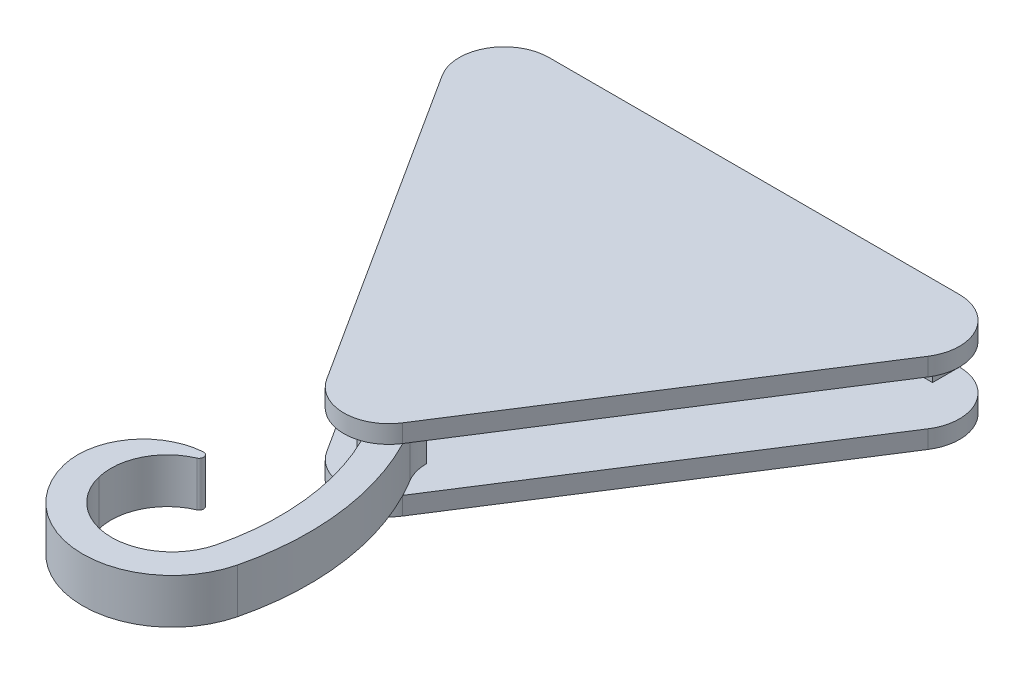
ISO-10303-21;
HEADER;
FILE_DESCRIPTION(('STEP AP214'),'2;1');
FILE_NAME('part.step','',(''),(''),'','','');
FILE_SCHEMA(('AUTOMOTIVE_DESIGN { 1 0 10303 214 1 1 1 1 }'));
ENDSEC;
DATA;
#1=APPLICATION_CONTEXT('core data for automotive mechanical design processes');
#2=APPLICATION_PROTOCOL_DEFINITION('international standard','automotive_design',2000,#1);
#3=PRODUCT_CONTEXT('',#1,'mechanical');
#4=PRODUCT('Part','Part','',(#3));
#5=PRODUCT_RELATED_PRODUCT_CATEGORY('part','',(#4));
#6=PRODUCT_DEFINITION_FORMATION('','',#4);
#7=PRODUCT_DEFINITION_CONTEXT('part definition',#1,'design');
#8=PRODUCT_DEFINITION('design','',#6,#7);
#9=PRODUCT_DEFINITION_SHAPE('','',#8);
#10=(LENGTH_UNIT() NAMED_UNIT(*) SI_UNIT(.MILLI.,.METRE.));
#11=(NAMED_UNIT(*) PLANE_ANGLE_UNIT() SI_UNIT($,.RADIAN.));
#12=(NAMED_UNIT(*) SI_UNIT($,.STERADIAN.) SOLID_ANGLE_UNIT());
#13=UNCERTAINTY_MEASURE_WITH_UNIT(LENGTH_MEASURE(1.E-05),#10,'distance_accuracy_value','');
#14=(GEOMETRIC_REPRESENTATION_CONTEXT(3) GLOBAL_UNCERTAINTY_ASSIGNED_CONTEXT((#13)) GLOBAL_UNIT_ASSIGNED_CONTEXT((#10,
#11,#12)) REPRESENTATION_CONTEXT('',''));
#15=CARTESIAN_POINT('',(0.,0.,0.));
#16=DIRECTION('',(0.,0.,1.));
#17=DIRECTION('',(1.,0.,0.));
#18=AXIS2_PLACEMENT_3D('',#15,#16,#17);
#19=CARTESIAN_POINT('',(0.,20.,407.244862002151));
#20=DIRECTION('',(0.,-1.,0.));
#21=DIRECTION('',(0.,0.,-1.));
#22=AXIS2_PLACEMENT_3D('',#19,#20,#21);
#23=PLANE('',#22);
#24=DIRECTION('',(0.,0.,-1.));
#25=VECTOR('',#24,1.);
#26=CARTESIAN_POINT('',(228.636711681377,20.,0.));
#27=LINE('',#26,#25);
#28=CARTESIAN_POINT('',(228.636711681377,20.,30.));
#29=VERTEX_POINT('',#28);
#30=CARTESIAN_POINT('',(228.636711681377,20.,0.));
#31=VERTEX_POINT('',#30);
#32=EDGE_CURVE('E58',#29,#31,#27,.T.);
#33=ORIENTED_EDGE('',*,*,#32,.F.);
#34=DIRECTION('',(1.,0.,0.));
#35=VECTOR('',#34,1.);
#36=CARTESIAN_POINT('',(228.636711681377,20.,30.));
#37=LINE('',#36,#35);
#38=CARTESIAN_POINT('',(-228.636711681377,20.,30.0000000000001));
#39=VERTEX_POINT('',#38);
#40=EDGE_CURVE('E63',#39,#29,#37,.T.);
#41=ORIENTED_EDGE('',*,*,#40,.F.);
#42=DIRECTION('',(0.,0.,1.));
#43=VECTOR('',#42,1.);
#44=CARTESIAN_POINT('',(-228.636711681377,20.,0.));
#45=LINE('',#44,#43);
#46=CARTESIAN_POINT('',(-228.636711681377,20.,0.));
#47=VERTEX_POINT('',#46);
#48=EDGE_CURVE('E253',#47,#39,#45,.T.);
#49=ORIENTED_EDGE('',*,*,#48,.F.);
#50=CARTESIAN_POINT('',(-228.636711681377,20.,50.));
#51=DIRECTION('',(0.,1.,0.));
#52=DIRECTION('',(0.,0.,-1.));
#53=AXIS2_PLACEMENT_3D('',#50,#51,#52);
#54=CIRCLE('',#53,50.);
#55=CARTESIAN_POINT('',(-270.750281714452,20.,76.9526848211684));
#56=VERTEX_POINT('',#55);
#57=EDGE_CURVE('E228',#47,#56,#54,.T.);
#58=ORIENTED_EDGE('',*,*,#57,.T.);
#59=DIRECTION('',(0.539053696423367,0.,0.842271400661511));
#60=VECTOR('',#59,1.);
#61=CARTESIAN_POINT('',(-270.750281714452,20.,76.9526848211684));
#62=LINE('',#61,#60);
#63=CARTESIAN_POINT('',(-42.1135700330756,20.,434.197546823319));
#64=VERTEX_POINT('',#63);
#65=EDGE_CURVE('E237',#56,#64,#62,.T.);
#66=ORIENTED_EDGE('',*,*,#65,.T.);
#67=CARTESIAN_POINT('',(0.,20.,407.244862002151));
#68=DIRECTION('',(0.,1.,0.));
#69=DIRECTION('',(0.,0.,-1.));
#70=AXIS2_PLACEMENT_3D('',#67,#68,#69);
#71=CIRCLE('',#70,50.);
#72=CARTESIAN_POINT('',(16.6552850478013,20.,454.389336545585));
#73=VERTEX_POINT('',#72);
#74=EDGE_CURVE('E478',#64,#73,#71,.T.);
#75=ORIENTED_EDGE('',*,*,#74,.T.);
#76=CARTESIAN_POINT('',(-224.009305688203,20.,571.900295172143));
#77=DIRECTION('',(0.,-1.,0.));
#78=DIRECTION('',(0.,0.,-1.));
#79=AXIS2_PLACEMENT_3D('',#76,#77,#78);
#80=CIRCLE('',#79,267.821340881306);
#81=CARTESIAN_POINT('',(10.5082209750438,20.,442.556565833553));
#82=VERTEX_POINT('',#81);
#83=EDGE_CURVE('E400',#82,#73,#80,.T.);
#84=ORIENTED_EDGE('',*,*,#83,.F.);
#85=CARTESIAN_POINT('',(54.2906779464581,20.,418.409175466347));
#86=DIRECTION('',(0.,1.,0.));
#87=DIRECTION('',(0.,0.,1.));
#88=AXIS2_PLACEMENT_3D('',#85,#86,#87);
#89=CIRCLE('',#88,50.);
#90=CARTESIAN_POINT('',(4.29067794645814,20.,418.409175466347));
#91=VERTEX_POINT('',#90);
#92=EDGE_CURVE('E395',#91,#82,#89,.T.);
#93=ORIENTED_EDGE('',*,*,#92,.F.);
#94=DIRECTION('',(0.,0.,-1.));
#95=VECTOR('',#94,1.);
#96=CARTESIAN_POINT('',(4.29067794645795,20.,431.873911572928));
#97=LINE('',#96,#95);
#98=CARTESIAN_POINT('',(4.29067794645795,20.,431.873911572928));
#99=VERTEX_POINT('',#98);
#100=EDGE_CURVE('E391',#99,#91,#97,.T.);
#101=ORIENTED_EDGE('',*,*,#100,.F.);
#102=CARTESIAN_POINT('',(0.,20.,407.244862002151));
#103=DIRECTION('',(0.,1.,0.));
#104=DIRECTION('',(0.,0.,1.));
#105=AXIS2_PLACEMENT_3D('',#102,#103,#104);
#106=CIRCLE('',#105,24.9999999999999);
#107=CARTESIAN_POINT('',(25.,20.,407.244862002151));
#108=VERTEX_POINT('',#107);
#109=EDGE_CURVE('E341',#108,#99,#106,.T.);
#110=ORIENTED_EDGE('',*,*,#109,.F.);
#111=DIRECTION('',(0.,0.,1.));
#112=VECTOR('',#111,1.);
#113=CARTESIAN_POINT('',(25.,20.,407.244862002151));
#114=LINE('',#113,#112);
#115=CARTESIAN_POINT('',(25.,20.,389.984284024528));
#116=VERTEX_POINT('',#115);
#117=EDGE_CURVE('E347',#116,#108,#114,.T.);
#118=ORIENTED_EDGE('',*,*,#117,.F.);
#119=CARTESIAN_POINT('',(75.,20.,389.984284024528));
#120=DIRECTION('',(0.,-1.,0.));
#121=DIRECTION('',(0.,0.,-1.));
#122=AXIS2_PLACEMENT_3D('',#119,#120,#121);
#123=CIRCLE('',#122,50.);
#124=CARTESIAN_POINT('',(32.2843849016854,20.,415.972285617045));
#125=VERTEX_POINT('',#124);
#126=EDGE_CURVE('E423',#125,#116,#123,.T.);
#127=ORIENTED_EDGE('',*,*,#126,.F.);
#128=CARTESIAN_POINT('',(-224.009305688203,20.,571.900295172143));
#129=DIRECTION('',(0.,1.,0.));
#130=DIRECTION('',(0.,0.,-1.));
#131=AXIS2_PLACEMENT_3D('',#128,#129,#130);
#132=CIRCLE('',#131,300.);
#133=CARTESIAN_POINT('',(42.338379552463,20.,433.846281949277));
#134=VERTEX_POINT('',#133);
#135=EDGE_CURVE('E49',#134,#125,#132,.T.);
#136=ORIENTED_EDGE('',*,*,#135,.F.);
#137=DIRECTION('',(0.539053696423367,0.,-0.842271400661511));
#138=VECTOR('',#137,1.);
#139=CARTESIAN_POINT('',(270.750281714452,20.,76.9526848211684));
#140=LINE('',#139,#138);
#141=CARTESIAN_POINT('',(270.750281714452,20.,76.9526848211684));
#142=VERTEX_POINT('',#141);
#143=EDGE_CURVE('E482',#134,#142,#140,.T.);
#144=ORIENTED_EDGE('',*,*,#143,.T.);
#145=CARTESIAN_POINT('',(228.636711681377,20.,50.));
#146=DIRECTION('',(0.,1.,0.));
#147=DIRECTION('',(0.,0.,1.));
#148=AXIS2_PLACEMENT_3D('',#145,#146,#147);
#149=CIRCLE('',#148,50.);
#150=EDGE_CURVE('E238',#142,#31,#149,.T.);
#151=ORIENTED_EDGE('',*,*,#150,.T.);
#152=EDGE_LOOP('',(#33,#41,#49,#58,#66,#75,#84,#93,#101,#110,#118,#127,#136,#144,#151));
#153=FACE_BOUND('',#152,.T.);
#154=ADVANCED_FACE('F39',(#153),#23,.F.);
#155=CARTESIAN_POINT('',(0.,70.,407.244862002151));
#156=DIRECTION('',(0.,-1.,0.));
#157=DIRECTION('',(0.,0.,-1.));
#158=AXIS2_PLACEMENT_3D('',#155,#156,#157);
#159=PLANE('',#158);
#160=DIRECTION('',(-1.,0.,0.));
#161=VECTOR('',#160,1.);
#162=CARTESIAN_POINT('',(228.636711681377,70.,30.));
#163=LINE('',#162,#161);
#164=CARTESIAN_POINT('',(228.636711681377,70.,30.));
#165=VERTEX_POINT('',#164);
#166=CARTESIAN_POINT('',(-228.636711681377,70.,30.));
#167=VERTEX_POINT('',#166);
#168=EDGE_CURVE('E270',#165,#167,#163,.T.);
#169=ORIENTED_EDGE('',*,*,#168,.F.);
#170=DIRECTION('',(0.,0.,1.));
#171=VECTOR('',#170,1.);
#172=CARTESIAN_POINT('',(228.636711681377,70.,0.));
#173=LINE('',#172,#171);
#174=CARTESIAN_POINT('',(228.636711681377,70.,0.));
#175=VERTEX_POINT('',#174);
#176=EDGE_CURVE('E279',#175,#165,#173,.T.);
#177=ORIENTED_EDGE('',*,*,#176,.F.);
#178=CARTESIAN_POINT('',(228.636711681377,70.,50.));
#179=DIRECTION('',(0.,1.,0.));
#180=DIRECTION('',(0.,0.,1.));
#181=AXIS2_PLACEMENT_3D('',#178,#179,#180);
#182=CIRCLE('',#181,50.);
#183=CARTESIAN_POINT('',(270.750281714452,70.,76.9526848211684));
#184=VERTEX_POINT('',#183);
#185=EDGE_CURVE('E310',#184,#175,#182,.T.);
#186=ORIENTED_EDGE('',*,*,#185,.F.);
#187=DIRECTION('',(0.539053696423367,0.,-0.842271400661511));
#188=VECTOR('',#187,1.);
#189=CARTESIAN_POINT('',(270.750281714452,70.,76.9526848211684));
#190=LINE('',#189,#188);
#191=CARTESIAN_POINT('',(42.3383795524631,70.,433.846281949277));
#192=VERTEX_POINT('',#191);
#193=EDGE_CURVE('E305',#192,#184,#190,.T.);
#194=ORIENTED_EDGE('',*,*,#193,.F.);
#195=CARTESIAN_POINT('',(-224.009305688203,70.,571.900295172143));
#196=DIRECTION('',(0.,1.,0.));
#197=DIRECTION('',(0.,0.,-1.));
#198=AXIS2_PLACEMENT_3D('',#195,#196,#197);
#199=CIRCLE('',#198,300.);
#200=CARTESIAN_POINT('',(32.2843849016854,70.,415.972285617045));
#201=VERTEX_POINT('',#200);
#202=EDGE_CURVE('E375',#192,#201,#199,.T.);
#203=ORIENTED_EDGE('',*,*,#202,.T.);
#204=CARTESIAN_POINT('',(75.,70.,389.984284024528));
#205=DIRECTION('',(0.,-1.,0.));
#206=DIRECTION('',(0.,0.,-1.));
#207=AXIS2_PLACEMENT_3D('',#204,#205,#206);
#208=CIRCLE('',#207,50.);
#209=CARTESIAN_POINT('',(25.,70.,389.984284024528));
#210=VERTEX_POINT('',#209);
#211=EDGE_CURVE('E379',#201,#210,#208,.T.);
#212=ORIENTED_EDGE('',*,*,#211,.T.);
#213=DIRECTION('',(0.,0.,1.));
#214=VECTOR('',#213,1.);
#215=CARTESIAN_POINT('',(25.,70.,407.244862002151));
#216=LINE('',#215,#214);
#217=CARTESIAN_POINT('',(25.,70.,407.244862002151));
#218=VERTEX_POINT('',#217);
#219=EDGE_CURVE('E383',#210,#218,#216,.T.);
#220=ORIENTED_EDGE('',*,*,#219,.T.);
#221=CARTESIAN_POINT('',(0.,70.,407.244862002151));
#222=DIRECTION('',(0.,1.,0.));
#223=DIRECTION('',(0.,0.,1.));
#224=AXIS2_PLACEMENT_3D('',#221,#222,#223);
#225=CIRCLE('',#224,24.9999999999999);
#226=CARTESIAN_POINT('',(4.29067794645795,70.,431.873911572928));
#227=VERTEX_POINT('',#226);
#228=EDGE_CURVE('E342',#218,#227,#225,.T.);
#229=ORIENTED_EDGE('',*,*,#228,.T.);
#230=DIRECTION('',(0.,0.,-1.));
#231=VECTOR('',#230,1.);
#232=CARTESIAN_POINT('',(4.29067794645795,70.,431.873911572928));
#233=LINE('',#232,#231);
#234=CARTESIAN_POINT('',(4.29067794645814,70.,418.409175466347));
#235=VERTEX_POINT('',#234);
#236=EDGE_CURVE('E346',#227,#235,#233,.T.);
#237=ORIENTED_EDGE('',*,*,#236,.T.);
#238=CARTESIAN_POINT('',(54.2906779464581,70.,418.409175466347));
#239=DIRECTION('',(0.,1.,0.));
#240=DIRECTION('',(0.,0.,1.));
#241=AXIS2_PLACEMENT_3D('',#238,#239,#240);
#242=CIRCLE('',#241,50.);
#243=CARTESIAN_POINT('',(10.5082209750438,70.,442.556565833553));
#244=VERTEX_POINT('',#243);
#245=EDGE_CURVE('E351',#235,#244,#242,.T.);
#246=ORIENTED_EDGE('',*,*,#245,.T.);
#247=CARTESIAN_POINT('',(-224.009305688203,70.,571.900295172143));
#248=DIRECTION('',(0.,-1.,0.));
#249=DIRECTION('',(0.,0.,-1.));
#250=AXIS2_PLACEMENT_3D('',#247,#248,#249);
#251=CIRCLE('',#250,267.821340881306);
#252=CARTESIAN_POINT('',(16.6552850478014,70.,454.389336545585));
#253=VERTEX_POINT('',#252);
#254=EDGE_CURVE('E356',#244,#253,#251,.T.);
#255=ORIENTED_EDGE('',*,*,#254,.T.);
#256=CARTESIAN_POINT('',(0.,70.,407.244862002151));
#257=DIRECTION('',(0.,1.,0.));
#258=DIRECTION('',(0.,0.,-1.));
#259=AXIS2_PLACEMENT_3D('',#256,#257,#258);
#260=CIRCLE('',#259,50.);
#261=CARTESIAN_POINT('',(-42.1135700330756,70.,434.197546823319));
#262=VERTEX_POINT('',#261);
#263=EDGE_CURVE('E51',#262,#253,#260,.T.);
#264=ORIENTED_EDGE('',*,*,#263,.F.);
#265=DIRECTION('',(0.539053696423367,0.,0.842271400661511));
#266=VECTOR('',#265,1.);
#267=CARTESIAN_POINT('',(-270.750281714452,70.,76.9526848211684));
#268=LINE('',#267,#266);
#269=CARTESIAN_POINT('',(-270.750281714452,70.,76.9526848211684));
#270=VERTEX_POINT('',#269);
#271=EDGE_CURVE('E287',#270,#262,#268,.T.);
#272=ORIENTED_EDGE('',*,*,#271,.F.);
#273=CARTESIAN_POINT('',(-228.636711681377,70.,50.));
#274=DIRECTION('',(0.,1.,0.));
#275=DIRECTION('',(0.,0.,-1.));
#276=AXIS2_PLACEMENT_3D('',#273,#274,#275);
#277=CIRCLE('',#276,50.);
#278=CARTESIAN_POINT('',(-228.636711681377,70.,0.));
#279=VERTEX_POINT('',#278);
#280=EDGE_CURVE('E314',#279,#270,#277,.T.);
#281=ORIENTED_EDGE('',*,*,#280,.F.);
#282=DIRECTION('',(0.,0.,-1.));
#283=VECTOR('',#282,1.);
#284=CARTESIAN_POINT('',(-228.636711681377,70.,0.));
#285=LINE('',#284,#283);
#286=EDGE_CURVE('E261',#167,#279,#285,.T.);
#287=ORIENTED_EDGE('',*,*,#286,.F.);
#288=EDGE_LOOP('',(#169,#177,#186,#194,#203,#212,#220,#229,#237,#246,#255,#264,#272,#281,#287));
#289=FACE_BOUND('',#288,.T.);
#290=ADVANCED_FACE('F542',(#289),#159,.T.);
#291=CARTESIAN_POINT('',(0.,20.,407.244862002151));
#292=DIRECTION('',(0.,-1.,0.));
#293=DIRECTION('',(0.,0.,-1.));
#294=AXIS2_PLACEMENT_3D('',#291,#292,#293);
#295=CYLINDRICAL_SURFACE('',#294,50.);
#296=CARTESIAN_POINT('',(0.,0.,407.244862002151));
#297=DIRECTION('',(0.,1.,0.));
#298=DIRECTION('',(0.,0.,-1.));
#299=AXIS2_PLACEMENT_3D('',#296,#297,#298);
#300=CIRCLE('',#299,50.);
#301=CARTESIAN_POINT('',(-42.1135700330756,0.,434.197546823319));
#302=VERTEX_POINT('',#301);
#303=CARTESIAN_POINT('',(42.1135700330756,0.,434.197546823319));
#304=VERTEX_POINT('',#303);
#305=EDGE_CURVE('E477',#302,#304,#300,.T.);
#306=ORIENTED_EDGE('',*,*,#305,.T.);
#307=DIRECTION('',(0.,-1.,0.));
#308=VECTOR('',#307,1.);
#309=CARTESIAN_POINT('',(42.1135700330756,20.,434.197546823319));
#310=LINE('',#309,#308);
#311=CARTESIAN_POINT('',(42.1135700330756,20.,434.197546823319));
#312=VERTEX_POINT('',#311);
#313=EDGE_CURVE('E43',#312,#304,#310,.T.);
#314=ORIENTED_EDGE('',*,*,#313,.F.);
#315=EDGE_CURVE('E483',#73,#312,#71,.T.);
#316=ORIENTED_EDGE('',*,*,#315,.F.);
#317=ORIENTED_EDGE('',*,*,#74,.F.);
#318=DIRECTION('',(0.,-1.,0.));
#319=VECTOR('',#318,1.);
#320=CARTESIAN_POINT('',(-42.1135700330756,20.,434.197546823319));
#321=LINE('',#320,#319);
#322=EDGE_CURVE('E492',#64,#302,#321,.T.);
#323=ORIENTED_EDGE('',*,*,#322,.T.);
#324=EDGE_LOOP('',(#306,#314,#316,#317,#323));
#325=FACE_BOUND('',#324,.T.);
#326=ADVANCED_FACE('F41',(#325),#295,.T.);
#327=CARTESIAN_POINT('',(270.750281714452,20.,76.9526848211684));
#328=DIRECTION('',(-0.842271400661511,0.,-0.539053696423367));
#329=DIRECTION('',(-0.539053696423367,0.,0.842271400661511));
#330=AXIS2_PLACEMENT_3D('',#327,#328,#329);
#331=PLANE('',#330);
#332=DIRECTION('',(0.539053696423367,0.,-0.842271400661511));
#333=VECTOR('',#332,1.);
#334=CARTESIAN_POINT('',(270.750281714452,0.,76.9526848211684));
#335=LINE('',#334,#333);
#336=CARTESIAN_POINT('',(270.750281714452,0.,76.9526848211684));
#337=VERTEX_POINT('',#336);
#338=EDGE_CURVE('E496',#304,#337,#335,.T.);
#339=ORIENTED_EDGE('',*,*,#338,.T.);
#340=DIRECTION('',(0.,-1.,0.));
#341=VECTOR('',#340,1.);
#342=CARTESIAN_POINT('',(270.750281714452,20.,76.9526848211684));
#343=LINE('',#342,#341);
#344=EDGE_CURVE('E516',#142,#337,#343,.T.);
#345=ORIENTED_EDGE('',*,*,#344,.F.);
#346=ORIENTED_EDGE('',*,*,#143,.F.);
#347=EDGE_CURVE('E484',#312,#134,#140,.T.);
#348=ORIENTED_EDGE('',*,*,#347,.F.);
#349=ORIENTED_EDGE('',*,*,#313,.T.);
#350=EDGE_LOOP('',(#339,#345,#346,#348,#349));
#351=FACE_BOUND('',#350,.T.);
#352=ADVANCED_FACE('F642',(#351),#331,.F.);
#353=CARTESIAN_POINT('',(228.636711681377,20.,50.));
#354=DIRECTION('',(0.,-1.,0.));
#355=DIRECTION('',(0.,0.,-1.));
#356=AXIS2_PLACEMENT_3D('',#353,#354,#355);
#357=CYLINDRICAL_SURFACE('',#356,50.);
#358=CARTESIAN_POINT('',(228.636711681377,0.,50.));
#359=DIRECTION('',(0.,1.,0.));
#360=DIRECTION('',(0.,0.,1.));
#361=AXIS2_PLACEMENT_3D('',#358,#359,#360);
#362=CIRCLE('',#361,50.);
#363=CARTESIAN_POINT('',(228.636711681377,0.,0.));
#364=VERTEX_POINT('',#363);
#365=EDGE_CURVE('E499',#337,#364,#362,.T.);
#366=ORIENTED_EDGE('',*,*,#365,.T.);
#367=DIRECTION('',(0.,-1.,0.));
#368=VECTOR('',#367,1.);
#369=CARTESIAN_POINT('',(228.636711681377,20.,0.));
#370=LINE('',#369,#368);
#371=EDGE_CURVE('E250',#31,#364,#370,.T.);
#372=ORIENTED_EDGE('',*,*,#371,.F.);
#373=ORIENTED_EDGE('',*,*,#150,.F.);
#374=ORIENTED_EDGE('',*,*,#344,.T.);
#375=EDGE_LOOP('',(#366,#372,#373,#374));
#376=FACE_BOUND('',#375,.T.);
#377=ADVANCED_FACE('F643',(#376),#357,.T.);
#378=CARTESIAN_POINT('',(-228.636711681377,20.,0.));
#379=DIRECTION('',(0.,0.,1.));
#380=DIRECTION('',(1.,0.,0.));
#381=AXIS2_PLACEMENT_3D('',#378,#379,#380);
#382=PLANE('',#381);
#383=DIRECTION('',(-1.,0.,0.));
#384=VECTOR('',#383,1.);
#385=CARTESIAN_POINT('',(-228.636711681377,0.,0.));
#386=LINE('',#385,#384);
#387=CARTESIAN_POINT('',(-228.636711681377,0.,0.));
#388=VERTEX_POINT('',#387);
#389=EDGE_CURVE('E248',#364,#388,#386,.T.);
#390=ORIENTED_EDGE('',*,*,#389,.T.);
#391=DIRECTION('',(0.,-1.,0.));
#392=VECTOR('',#391,1.);
#393=CARTESIAN_POINT('',(-228.636711681377,20.,0.));
#394=LINE('',#393,#392);
#395=EDGE_CURVE('E231',#47,#388,#394,.T.);
#396=ORIENTED_EDGE('',*,*,#395,.F.);
#397=DIRECTION('',(0.,-1.,0.));
#398=VECTOR('',#397,1.);
#399=CARTESIAN_POINT('',(-228.636711681377,90.002,0.));
#400=LINE('',#399,#398);
#401=EDGE_CURVE('E244',#279,#47,#400,.T.);
#402=ORIENTED_EDGE('',*,*,#401,.F.);
#403=DIRECTION('',(0.,-1.,0.));
#404=VECTOR('',#403,1.);
#405=CARTESIAN_POINT('',(-228.636711681377,90.,0.));
#406=LINE('',#405,#404);
#407=CARTESIAN_POINT('',(-228.636711681377,90.,0.));
#408=VERTEX_POINT('',#407);
#409=EDGE_CURVE('E326',#408,#279,#406,.T.);
#410=ORIENTED_EDGE('',*,*,#409,.F.);
#411=DIRECTION('',(-1.,0.,0.));
#412=VECTOR('',#411,1.);
#413=CARTESIAN_POINT('',(-228.636711681377,90.,0.));
#414=LINE('',#413,#412);
#415=CARTESIAN_POINT('',(228.636711681377,90.,0.));
#416=VERTEX_POINT('',#415);
#417=EDGE_CURVE('E293',#416,#408,#414,.T.);
#418=ORIENTED_EDGE('',*,*,#417,.F.);
#419=DIRECTION('',(0.,-1.,0.));
#420=VECTOR('',#419,1.);
#421=CARTESIAN_POINT('',(228.636711681377,90.,0.));
#422=LINE('',#421,#420);
#423=EDGE_CURVE('E329',#416,#175,#422,.T.);
#424=ORIENTED_EDGE('',*,*,#423,.T.);
#425=DIRECTION('',(0.,-1.,0.));
#426=VECTOR('',#425,1.);
#427=CARTESIAN_POINT('',(228.636711681377,90.002,0.));
#428=LINE('',#427,#426);
#429=EDGE_CURVE('E264',#175,#31,#428,.T.);
#430=ORIENTED_EDGE('',*,*,#429,.T.);
#431=ORIENTED_EDGE('',*,*,#371,.T.);
#432=EDGE_LOOP('',(#390,#396,#402,#410,#418,#424,#430,#431));
#433=FACE_BOUND('',#432,.T.);
#434=ADVANCED_FACE('F241',(#433),#382,.F.);
#435=CARTESIAN_POINT('',(-228.636711681377,20.,50.));
#436=DIRECTION('',(0.,-1.,0.));
#437=DIRECTION('',(0.,0.,-1.));
#438=AXIS2_PLACEMENT_3D('',#435,#436,#437);
#439=CYLINDRICAL_SURFACE('',#438,50.);
#440=CARTESIAN_POINT('',(-228.636711681377,0.,50.));
#441=DIRECTION('',(0.,1.,0.));
#442=DIRECTION('',(0.,0.,-1.));
#443=AXIS2_PLACEMENT_3D('',#440,#441,#442);
#444=CIRCLE('',#443,50.);
#445=CARTESIAN_POINT('',(-270.750281714452,0.,76.9526848211684));
#446=VERTEX_POINT('',#445);
#447=EDGE_CURVE('E504',#388,#446,#444,.T.);
#448=ORIENTED_EDGE('',*,*,#447,.T.);
#449=DIRECTION('',(0.,-1.,0.));
#450=VECTOR('',#449,1.);
#451=CARTESIAN_POINT('',(-270.750281714452,20.,76.9526848211684));
#452=LINE('',#451,#450);
#453=EDGE_CURVE('E234',#56,#446,#452,.T.);
#454=ORIENTED_EDGE('',*,*,#453,.F.);
#455=ORIENTED_EDGE('',*,*,#57,.F.);
#456=ORIENTED_EDGE('',*,*,#395,.T.);
#457=EDGE_LOOP('',(#448,#454,#455,#456));
#458=FACE_BOUND('',#457,.T.);
#459=ADVANCED_FACE('F230',(#458),#439,.T.);
#460=CARTESIAN_POINT('',(-270.750281714452,20.,76.9526848211684));
#461=DIRECTION('',(0.842271400661511,0.,-0.539053696423367));
#462=DIRECTION('',(-0.539053696423367,0.,-0.842271400661511));
#463=AXIS2_PLACEMENT_3D('',#460,#461,#462);
#464=PLANE('',#463);
#465=DIRECTION('',(0.539053696423367,0.,0.842271400661511));
#466=VECTOR('',#465,1.);
#467=CARTESIAN_POINT('',(-270.750281714452,0.,76.9526848211684));
#468=LINE('',#467,#466);
#469=EDGE_CURVE('E507',#446,#302,#468,.T.);
#470=ORIENTED_EDGE('',*,*,#469,.T.);
#471=ORIENTED_EDGE('',*,*,#322,.F.);
#472=ORIENTED_EDGE('',*,*,#65,.F.);
#473=ORIENTED_EDGE('',*,*,#453,.T.);
#474=EDGE_LOOP('',(#470,#471,#472,#473));
#475=FACE_BOUND('',#474,.T.);
#476=ADVANCED_FACE('F589',(#475),#464,.F.);
#477=CARTESIAN_POINT('',(0.,0.,407.244862002151));
#478=DIRECTION('',(0.,-1.,0.));
#479=DIRECTION('',(0.,0.,-1.));
#480=AXIS2_PLACEMENT_3D('',#477,#478,#479);
#481=PLANE('',#480);
#482=ORIENTED_EDGE('',*,*,#305,.F.);
#483=ORIENTED_EDGE('',*,*,#469,.F.);
#484=ORIENTED_EDGE('',*,*,#447,.F.);
#485=ORIENTED_EDGE('',*,*,#389,.F.);
#486=ORIENTED_EDGE('',*,*,#365,.F.);
#487=ORIENTED_EDGE('',*,*,#338,.F.);
#488=EDGE_LOOP('',(#482,#483,#484,#485,#486,#487));
#489=FACE_BOUND('',#488,.T.);
#490=ADVANCED_FACE('F586',(#489),#481,.T.);
#491=CARTESIAN_POINT('',(0.,20.,407.244862002151));
#492=DIRECTION('',(0.,1.,0.));
#493=DIRECTION('',(0.,0.,1.));
#494=AXIS2_PLACEMENT_3D('',#491,#492,#493);
#495=PLANE('',#494);
#496=CARTESIAN_POINT('',(36.2061737695586,20.,635.273593035109));
#497=VERTEX_POINT('',#496);
#498=EDGE_CURVE('E399',#73,#497,#80,.T.);
#499=ORIENTED_EDGE('',*,*,#498,.F.);
#500=ORIENTED_EDGE('',*,*,#315,.T.);
#501=ORIENTED_EDGE('',*,*,#347,.T.);
#502=CARTESIAN_POINT('',(67.4709907678041,20.,642.887877029243));
#503=VERTEX_POINT('',#502);
#504=EDGE_CURVE('E419',#503,#134,#132,.T.);
#505=ORIENTED_EDGE('',*,*,#504,.F.);
#506=CARTESIAN_POINT('',(-29.1989262081886,20.,619.344729420677));
#507=DIRECTION('',(0.,1.,0.));
#508=DIRECTION('',(0.,0.,-1.));
#509=AXIS2_PLACEMENT_3D('',#506,#507,#508);
#510=CIRCLE('',#509,99.4954905885893);
#511=CARTESIAN_POINT('',(-125.868843184181,20.,642.887877029243));
#512=VERTEX_POINT('',#511);
#513=EDGE_CURVE('E416',#512,#503,#510,.T.);
#514=ORIENTED_EDGE('',*,*,#513,.F.);
#515=CARTESIAN_POINT('',(-55.0951894646038,20.,625.651547171513));
#516=DIRECTION('',(0.,1.,0.));
#517=DIRECTION('',(0.,0.,-1.));
#518=AXIS2_PLACEMENT_3D('',#515,#516,#517);
#519=CIRCLE('',#518,72.8423031471626);
#520=CARTESIAN_POINT('',(-60.7341064591325,20.,553.02783380658));
#521=VERTEX_POINT('',#520);
#522=EDGE_CURVE('E413',#521,#512,#519,.T.);
#523=ORIENTED_EDGE('',*,*,#522,.F.);
#524=CARTESIAN_POINT('',(-60.3470431215595,20.,558.012829490902));
#525=DIRECTION('',(0.,1.,0.));
#526=DIRECTION('',(0.,0.,1.));
#527=AXIS2_PLACEMENT_3D('',#524,#525,#526);
#528=CIRCLE('',#527,4.99999999999999);
#529=CARTESIAN_POINT('',(-58.3687133550595,20.,562.604801979384));
#530=VERTEX_POINT('',#529);
#531=EDGE_CURVE('E410',#530,#521,#528,.T.);
#532=ORIENTED_EDGE('',*,*,#531,.F.);
#533=CARTESIAN_POINT('',(-33.4751425078328,20.,620.386166040237));
#534=DIRECTION('',(0.,-1.,0.));
#535=DIRECTION('',(0.,0.,-1.));
#536=AXIS2_PLACEMENT_3D('',#533,#534,#535);
#537=CIRCLE('',#536,62.9156252631945);
#538=CARTESIAN_POINT('',(-94.604026185936,20.,635.27359303511));
#539=VERTEX_POINT('',#538);
#540=EDGE_CURVE('E407',#539,#530,#537,.T.);
#541=ORIENTED_EDGE('',*,*,#540,.F.);
#542=CARTESIAN_POINT('',(-29.1989262081886,20.,619.344729420677));
#543=DIRECTION('',(0.,-1.,0.));
#544=DIRECTION('',(0.,0.,-1.));
#545=AXIS2_PLACEMENT_3D('',#542,#543,#544);
#546=CIRCLE('',#545,67.3168314698955);
#547=EDGE_CURVE('E404',#497,#539,#546,.T.);
#548=ORIENTED_EDGE('',*,*,#547,.F.);
#549=EDGE_LOOP('',(#499,#500,#501,#505,#514,#523,#532,#541,#548));
#550=FACE_BOUND('',#549,.T.);
#551=ADVANCED_FACE('F597',(#550),#495,.F.);
#552=CARTESIAN_POINT('',(0.,70.,407.244862002151));
#553=DIRECTION('',(0.,-1.,0.));
#554=DIRECTION('',(0.,0.,-1.));
#555=AXIS2_PLACEMENT_3D('',#552,#553,#554);
#556=CYLINDRICAL_SURFACE('',#555,24.9999999999999);
#557=ORIENTED_EDGE('',*,*,#109,.T.);
#558=DIRECTION('',(0.,-1.,0.));
#559=VECTOR('',#558,1.);
#560=CARTESIAN_POINT('',(4.29067794645795,70.,431.873911572928));
#561=LINE('',#560,#559);
#562=EDGE_CURVE('E473',#227,#99,#561,.T.);
#563=ORIENTED_EDGE('',*,*,#562,.F.);
#564=ORIENTED_EDGE('',*,*,#228,.F.);
#565=DIRECTION('',(0.,-1.,0.));
#566=VECTOR('',#565,1.);
#567=CARTESIAN_POINT('',(25.,70.,407.244862002151));
#568=LINE('',#567,#566);
#569=EDGE_CURVE('E387',#218,#108,#568,.T.);
#570=ORIENTED_EDGE('',*,*,#569,.T.);
#571=EDGE_LOOP('',(#557,#563,#564,#570));
#572=FACE_BOUND('',#571,.T.);
#573=ADVANCED_FACE('F612',(#572),#556,.T.);
#574=CARTESIAN_POINT('',(4.29067794645795,70.,431.873911572928));
#575=DIRECTION('',(-1.,0.,0.));
#576=DIRECTION('',(0.,0.,1.));
#577=AXIS2_PLACEMENT_3D('',#574,#575,#576);
#578=PLANE('',#577);
#579=ORIENTED_EDGE('',*,*,#100,.T.);
#580=DIRECTION('',(0.,-1.,0.));
#581=VECTOR('',#580,1.);
#582=CARTESIAN_POINT('',(4.29067794645814,70.,418.409175466347));
#583=LINE('',#582,#581);
#584=EDGE_CURVE('E469',#235,#91,#583,.T.);
#585=ORIENTED_EDGE('',*,*,#584,.F.);
#586=ORIENTED_EDGE('',*,*,#236,.F.);
#587=ORIENTED_EDGE('',*,*,#562,.T.);
#588=EDGE_LOOP('',(#579,#585,#586,#587));
#589=FACE_BOUND('',#588,.T.);
#590=ADVANCED_FACE('F608',(#589),#578,.F.);
#591=CARTESIAN_POINT('',(54.2906779464581,70.,418.409175466347));
#592=DIRECTION('',(0.,-1.,0.));
#593=DIRECTION('',(0.,0.,-1.));
#594=AXIS2_PLACEMENT_3D('',#591,#592,#593);
#595=CYLINDRICAL_SURFACE('',#594,50.);
#596=ORIENTED_EDGE('',*,*,#92,.T.);
#597=DIRECTION('',(0.,-1.,0.));
#598=VECTOR('',#597,1.);
#599=CARTESIAN_POINT('',(10.5082209750438,70.,442.556565833553));
#600=LINE('',#599,#598);
#601=EDGE_CURVE('E465',#244,#82,#600,.T.);
#602=ORIENTED_EDGE('',*,*,#601,.F.);
#603=ORIENTED_EDGE('',*,*,#245,.F.);
#604=ORIENTED_EDGE('',*,*,#584,.T.);
#605=EDGE_LOOP('',(#596,#602,#603,#604));
#606=FACE_BOUND('',#605,.T.);
#607=ADVANCED_FACE('F606',(#606),#595,.T.);
#608=CARTESIAN_POINT('',(-224.009305688203,70.,571.900295172143));
#609=DIRECTION('',(0.,-1.,0.));
#610=DIRECTION('',(0.,0.,-1.));
#611=AXIS2_PLACEMENT_3D('',#608,#609,#610);
#612=CYLINDRICAL_SURFACE('',#611,267.821340881306);
#613=ORIENTED_EDGE('',*,*,#83,.T.);
#614=ORIENTED_EDGE('',*,*,#498,.T.);
#615=DIRECTION('',(0.,-1.,0.));
#616=VECTOR('',#615,1.);
#617=CARTESIAN_POINT('',(36.2061737695586,70.,635.273593035109));
#618=LINE('',#617,#616);
#619=CARTESIAN_POINT('',(36.2061737695586,70.,635.273593035109));
#620=VERTEX_POINT('',#619);
#621=EDGE_CURVE('E461',#620,#497,#618,.T.);
#622=ORIENTED_EDGE('',*,*,#621,.F.);
#623=EDGE_CURVE('E355',#253,#620,#251,.T.);
#624=ORIENTED_EDGE('',*,*,#623,.F.);
#625=ORIENTED_EDGE('',*,*,#254,.F.);
#626=ORIENTED_EDGE('',*,*,#601,.T.);
#627=EDGE_LOOP('',(#613,#614,#622,#624,#625,#626));
#628=FACE_BOUND('',#627,.T.);
#629=ADVANCED_FACE('F601',(#628),#612,.F.);
#630=CARTESIAN_POINT('',(-29.1989262081886,70.,619.344729420677));
#631=DIRECTION('',(0.,-1.,0.));
#632=DIRECTION('',(0.,0.,-1.));
#633=AXIS2_PLACEMENT_3D('',#630,#631,#632);
#634=CYLINDRICAL_SURFACE('',#633,67.3168314698955);
#635=ORIENTED_EDGE('',*,*,#547,.T.);
#636=DIRECTION('',(0.,-1.,0.));
#637=VECTOR('',#636,1.);
#638=CARTESIAN_POINT('',(-94.604026185936,70.,635.27359303511));
#639=LINE('',#638,#637);
#640=CARTESIAN_POINT('',(-94.604026185936,70.,635.27359303511));
#641=VERTEX_POINT('',#640);
#642=EDGE_CURVE('E457',#641,#539,#639,.T.);
#643=ORIENTED_EDGE('',*,*,#642,.F.);
#644=CARTESIAN_POINT('',(-29.1989262081886,70.,619.344729420677));
#645=DIRECTION('',(0.,-1.,0.));
#646=DIRECTION('',(0.,0.,-1.));
#647=AXIS2_PLACEMENT_3D('',#644,#645,#646);
#648=CIRCLE('',#647,67.3168314698955);
#649=EDGE_CURVE('E360',#620,#641,#648,.T.);
#650=ORIENTED_EDGE('',*,*,#649,.F.);
#651=ORIENTED_EDGE('',*,*,#621,.T.);
#652=EDGE_LOOP('',(#635,#643,#650,#651));
#653=FACE_BOUND('',#652,.T.);
#654=ADVANCED_FACE('F622',(#653),#634,.F.);
#655=CARTESIAN_POINT('',(-33.4751425078328,70.,620.386166040237));
#656=DIRECTION('',(0.,-1.,0.));
#657=DIRECTION('',(0.,0.,-1.));
#658=AXIS2_PLACEMENT_3D('',#655,#656,#657);
#659=CYLINDRICAL_SURFACE('',#658,62.9156252631945);
#660=ORIENTED_EDGE('',*,*,#540,.T.);
#661=DIRECTION('',(0.,-1.,0.));
#662=VECTOR('',#661,1.);
#663=CARTESIAN_POINT('',(-58.3687133550595,70.,562.604801979384));
#664=LINE('',#663,#662);
#665=CARTESIAN_POINT('',(-58.3687133550595,70.,562.604801979384));
#666=VERTEX_POINT('',#665);
#667=EDGE_CURVE('E453',#666,#530,#664,.T.);
#668=ORIENTED_EDGE('',*,*,#667,.F.);
#669=CARTESIAN_POINT('',(-33.4751425078328,70.,620.386166040237));
#670=DIRECTION('',(0.,-1.,0.));
#671=DIRECTION('',(0.,0.,-1.));
#672=AXIS2_PLACEMENT_3D('',#669,#670,#671);
#673=CIRCLE('',#672,62.9156252631945);
#674=EDGE_CURVE('E363',#641,#666,#673,.T.);
#675=ORIENTED_EDGE('',*,*,#674,.F.);
#676=ORIENTED_EDGE('',*,*,#642,.T.);
#677=EDGE_LOOP('',(#660,#668,#675,#676));
#678=FACE_BOUND('',#677,.T.);
#679=ADVANCED_FACE('F628',(#678),#659,.F.);
#680=CARTESIAN_POINT('',(-60.3470431215595,70.,558.012829490902));
#681=DIRECTION('',(0.,-1.,0.));
#682=DIRECTION('',(0.,0.,-1.));
#683=AXIS2_PLACEMENT_3D('',#680,#681,#682);
#684=CYLINDRICAL_SURFACE('',#683,4.99999999999999);
#685=ORIENTED_EDGE('',*,*,#531,.T.);
#686=DIRECTION('',(0.,-1.,0.));
#687=VECTOR('',#686,1.);
#688=CARTESIAN_POINT('',(-60.7341064591325,70.,553.02783380658));
#689=LINE('',#688,#687);
#690=CARTESIAN_POINT('',(-60.7341064591325,70.,553.02783380658));
#691=VERTEX_POINT('',#690);
#692=EDGE_CURVE('E449',#691,#521,#689,.T.);
#693=ORIENTED_EDGE('',*,*,#692,.F.);
#694=CARTESIAN_POINT('',(-60.3470431215595,70.,558.012829490902));
#695=DIRECTION('',(0.,1.,0.));
#696=DIRECTION('',(0.,0.,1.));
#697=AXIS2_PLACEMENT_3D('',#694,#695,#696);
#698=CIRCLE('',#697,4.99999999999999);
#699=EDGE_CURVE('E366',#666,#691,#698,.T.);
#700=ORIENTED_EDGE('',*,*,#699,.F.);
#701=ORIENTED_EDGE('',*,*,#667,.T.);
#702=EDGE_LOOP('',(#685,#693,#700,#701));
#703=FACE_BOUND('',#702,.T.);
#704=ADVANCED_FACE('F631',(#703),#684,.T.);
#705=CARTESIAN_POINT('',(-55.0951894646038,70.,625.651547171513));
#706=DIRECTION('',(0.,-1.,0.));
#707=DIRECTION('',(0.,0.,-1.));
#708=AXIS2_PLACEMENT_3D('',#705,#706,#707);
#709=CYLINDRICAL_SURFACE('',#708,72.8423031471626);
#710=ORIENTED_EDGE('',*,*,#522,.T.);
#711=DIRECTION('',(0.,-1.,0.));
#712=VECTOR('',#711,1.);
#713=CARTESIAN_POINT('',(-125.868843184181,70.,642.887877029243));
#714=LINE('',#713,#712);
#715=CARTESIAN_POINT('',(-125.868843184181,70.,642.887877029243));
#716=VERTEX_POINT('',#715);
#717=EDGE_CURVE('E445',#716,#512,#714,.T.);
#718=ORIENTED_EDGE('',*,*,#717,.F.);
#719=CARTESIAN_POINT('',(-55.0951894646038,70.,625.651547171513));
#720=DIRECTION('',(0.,1.,0.));
#721=DIRECTION('',(0.,0.,-1.));
#722=AXIS2_PLACEMENT_3D('',#719,#720,#721);
#723=CIRCLE('',#722,72.8423031471626);
#724=EDGE_CURVE('E369',#691,#716,#723,.T.);
#725=ORIENTED_EDGE('',*,*,#724,.F.);
#726=ORIENTED_EDGE('',*,*,#692,.T.);
#727=EDGE_LOOP('',(#710,#718,#725,#726));
#728=FACE_BOUND('',#727,.T.);
#729=ADVANCED_FACE('F636',(#728),#709,.T.);
#730=CARTESIAN_POINT('',(-29.1989262081886,70.,619.344729420677));
#731=DIRECTION('',(0.,-1.,0.));
#732=DIRECTION('',(0.,0.,-1.));
#733=AXIS2_PLACEMENT_3D('',#730,#731,#732);
#734=CYLINDRICAL_SURFACE('',#733,99.4954905885893);
#735=ORIENTED_EDGE('',*,*,#513,.T.);
#736=DIRECTION('',(0.,-1.,0.));
#737=VECTOR('',#736,1.);
#738=CARTESIAN_POINT('',(67.4709907678041,70.,642.887877029243));
#739=LINE('',#738,#737);
#740=CARTESIAN_POINT('',(67.4709907678041,70.,642.887877029243));
#741=VERTEX_POINT('',#740);
#742=EDGE_CURVE('E441',#741,#503,#739,.T.);
#743=ORIENTED_EDGE('',*,*,#742,.F.);
#744=CARTESIAN_POINT('',(-29.1989262081886,70.,619.344729420677));
#745=DIRECTION('',(0.,1.,0.));
#746=DIRECTION('',(0.,0.,-1.));
#747=AXIS2_PLACEMENT_3D('',#744,#745,#746);
#748=CIRCLE('',#747,99.4954905885893);
#749=EDGE_CURVE('E372',#716,#741,#748,.T.);
#750=ORIENTED_EDGE('',*,*,#749,.F.);
#751=ORIENTED_EDGE('',*,*,#717,.T.);
#752=EDGE_LOOP('',(#735,#743,#750,#751));
#753=FACE_BOUND('',#752,.T.);
#754=ADVANCED_FACE('F640',(#753),#734,.T.);
#755=CARTESIAN_POINT('',(-224.009305688203,70.,571.900295172143));
#756=DIRECTION('',(0.,-1.,0.));
#757=DIRECTION('',(0.,0.,-1.));
#758=AXIS2_PLACEMENT_3D('',#755,#756,#757);
#759=CYLINDRICAL_SURFACE('',#758,300.);
#760=ORIENTED_EDGE('',*,*,#504,.T.);
#761=ORIENTED_EDGE('',*,*,#135,.T.);
#762=DIRECTION('',(0.,-1.,0.));
#763=VECTOR('',#762,1.);
#764=CARTESIAN_POINT('',(32.2843849016854,70.,415.972285617045));
#765=LINE('',#764,#763);
#766=EDGE_CURVE('E437',#201,#125,#765,.T.);
#767=ORIENTED_EDGE('',*,*,#766,.F.);
#768=ORIENTED_EDGE('',*,*,#202,.F.);
#769=EDGE_CURVE('E376',#741,#192,#199,.T.);
#770=ORIENTED_EDGE('',*,*,#769,.F.);
#771=ORIENTED_EDGE('',*,*,#742,.T.);
#772=EDGE_LOOP('',(#760,#761,#767,#768,#770,#771));
#773=FACE_BOUND('',#772,.T.);
#774=ADVANCED_FACE('F530',(#773),#759,.T.);
#775=CARTESIAN_POINT('',(75.,70.,389.984284024528));
#776=DIRECTION('',(0.,-1.,0.));
#777=DIRECTION('',(0.,0.,-1.));
#778=AXIS2_PLACEMENT_3D('',#775,#776,#777);
#779=CYLINDRICAL_SURFACE('',#778,50.);
#780=ORIENTED_EDGE('',*,*,#126,.T.);
#781=DIRECTION('',(0.,-1.,0.));
#782=VECTOR('',#781,1.);
#783=CARTESIAN_POINT('',(25.,70.,389.984284024528));
#784=LINE('',#783,#782);
#785=EDGE_CURVE('E433',#210,#116,#784,.T.);
#786=ORIENTED_EDGE('',*,*,#785,.F.);
#787=ORIENTED_EDGE('',*,*,#211,.F.);
#788=ORIENTED_EDGE('',*,*,#766,.T.);
#789=EDGE_LOOP('',(#780,#786,#787,#788));
#790=FACE_BOUND('',#789,.T.);
#791=ADVANCED_FACE('F536',(#790),#779,.F.);
#792=CARTESIAN_POINT('',(25.,70.,407.244862002151));
#793=DIRECTION('',(1.,0.,0.));
#794=DIRECTION('',(0.,0.,-1.));
#795=AXIS2_PLACEMENT_3D('',#792,#793,#794);
#796=PLANE('',#795);
#797=ORIENTED_EDGE('',*,*,#117,.T.);
#798=ORIENTED_EDGE('',*,*,#569,.F.);
#799=ORIENTED_EDGE('',*,*,#219,.F.);
#800=ORIENTED_EDGE('',*,*,#785,.T.);
#801=EDGE_LOOP('',(#797,#798,#799,#800));
#802=FACE_BOUND('',#801,.T.);
#803=ADVANCED_FACE('F614',(#802),#796,.F.);
#804=CARTESIAN_POINT('',(0.,70.,407.244862002151));
#805=DIRECTION('',(0.,1.,0.));
#806=DIRECTION('',(0.,0.,1.));
#807=AXIS2_PLACEMENT_3D('',#804,#805,#806);
#808=PLANE('',#807);
#809=CARTESIAN_POINT('',(42.1135700330756,70.,434.197546823319));
#810=VERTEX_POINT('',#809);
#811=EDGE_CURVE('E11',#253,#810,#260,.T.);
#812=ORIENTED_EDGE('',*,*,#811,.F.);
#813=ORIENTED_EDGE('',*,*,#623,.T.);
#814=ORIENTED_EDGE('',*,*,#649,.T.);
#815=ORIENTED_EDGE('',*,*,#674,.T.);
#816=ORIENTED_EDGE('',*,*,#699,.T.);
#817=ORIENTED_EDGE('',*,*,#724,.T.);
#818=ORIENTED_EDGE('',*,*,#749,.T.);
#819=ORIENTED_EDGE('',*,*,#769,.T.);
#820=EDGE_CURVE('E306',#810,#192,#190,.T.);
#821=ORIENTED_EDGE('',*,*,#820,.F.);
#822=EDGE_LOOP('',(#812,#813,#814,#815,#816,#817,#818,#819,#821));
#823=FACE_BOUND('',#822,.T.);
#824=ADVANCED_FACE('F618',(#823),#808,.T.);
#825=CARTESIAN_POINT('',(0.,90.,407.244862002151));
#826=DIRECTION('',(0.,-1.,0.));
#827=DIRECTION('',(0.,0.,-1.));
#828=AXIS2_PLACEMENT_3D('',#825,#826,#827);
#829=CYLINDRICAL_SURFACE('',#828,50.);
#830=ORIENTED_EDGE('',*,*,#263,.T.);
#831=ORIENTED_EDGE('',*,*,#811,.T.);
#832=DIRECTION('',(0.,-1.,0.));
#833=VECTOR('',#832,1.);
#834=CARTESIAN_POINT('',(42.1135700330756,90.,434.197546823319));
#835=LINE('',#834,#833);
#836=CARTESIAN_POINT('',(42.1135700330756,90.,434.197546823319));
#837=VERTEX_POINT('',#836);
#838=EDGE_CURVE('E337',#837,#810,#835,.T.);
#839=ORIENTED_EDGE('',*,*,#838,.F.);
#840=CARTESIAN_POINT('',(0.,90.,407.244862002151));
#841=DIRECTION('',(0.,1.,0.));
#842=DIRECTION('',(0.,0.,-1.));
#843=AXIS2_PLACEMENT_3D('',#840,#841,#842);
#844=CIRCLE('',#843,50.);
#845=CARTESIAN_POINT('',(-42.1135700330756,90.,434.197546823319));
#846=VERTEX_POINT('',#845);
#847=EDGE_CURVE('E282',#846,#837,#844,.T.);
#848=ORIENTED_EDGE('',*,*,#847,.F.);
#849=DIRECTION('',(0.,-1.,0.));
#850=VECTOR('',#849,1.);
#851=CARTESIAN_POINT('',(-42.1135700330756,90.,434.197546823319));
#852=LINE('',#851,#850);
#853=EDGE_CURVE('E301',#846,#262,#852,.T.);
#854=ORIENTED_EDGE('',*,*,#853,.T.);
#855=EDGE_LOOP('',(#830,#831,#839,#848,#854));
#856=FACE_BOUND('',#855,.T.);
#857=ADVANCED_FACE('F616',(#856),#829,.T.);
#858=CARTESIAN_POINT('',(270.750281714452,90.,76.9526848211684));
#859=DIRECTION('',(-0.842271400661511,0.,-0.539053696423367));
#860=DIRECTION('',(-0.539053696423367,0.,0.842271400661511));
#861=AXIS2_PLACEMENT_3D('',#858,#859,#860);
#862=PLANE('',#861);
#863=ORIENTED_EDGE('',*,*,#820,.T.);
#864=ORIENTED_EDGE('',*,*,#193,.T.);
#865=DIRECTION('',(0.,-1.,0.));
#866=VECTOR('',#865,1.);
#867=CARTESIAN_POINT('',(270.750281714452,90.,76.9526848211684));
#868=LINE('',#867,#866);
#869=CARTESIAN_POINT('',(270.750281714452,90.,76.9526848211684));
#870=VERTEX_POINT('',#869);
#871=EDGE_CURVE('E333',#870,#184,#868,.T.);
#872=ORIENTED_EDGE('',*,*,#871,.F.);
#873=DIRECTION('',(0.539053696423367,0.,-0.842271400661511));
#874=VECTOR('',#873,1.);
#875=CARTESIAN_POINT('',(270.750281714452,90.,76.9526848211684));
#876=LINE('',#875,#874);
#877=EDGE_CURVE('E286',#837,#870,#876,.T.);
#878=ORIENTED_EDGE('',*,*,#877,.F.);
#879=ORIENTED_EDGE('',*,*,#838,.T.);
#880=EDGE_LOOP('',(#863,#864,#872,#878,#879));
#881=FACE_BOUND('',#880,.T.);
#882=ADVANCED_FACE('F551',(#881),#862,.F.);
#883=CARTESIAN_POINT('',(228.636711681377,90.,50.));
#884=DIRECTION('',(0.,-1.,0.));
#885=DIRECTION('',(0.,0.,-1.));
#886=AXIS2_PLACEMENT_3D('',#883,#884,#885);
#887=CYLINDRICAL_SURFACE('',#886,50.);
#888=ORIENTED_EDGE('',*,*,#185,.T.);
#889=ORIENTED_EDGE('',*,*,#423,.F.);
#890=CARTESIAN_POINT('',(228.636711681377,90.,50.));
#891=DIRECTION('',(0.,1.,0.));
#892=DIRECTION('',(0.,0.,1.));
#893=AXIS2_PLACEMENT_3D('',#890,#891,#892);
#894=CIRCLE('',#893,50.);
#895=EDGE_CURVE('E290',#870,#416,#894,.T.);
#896=ORIENTED_EDGE('',*,*,#895,.F.);
#897=ORIENTED_EDGE('',*,*,#871,.T.);
#898=EDGE_LOOP('',(#888,#889,#896,#897));
#899=FACE_BOUND('',#898,.T.);
#900=ADVANCED_FACE('F554',(#899),#887,.T.);
#901=CARTESIAN_POINT('',(-228.636711681377,90.,50.));
#902=DIRECTION('',(0.,-1.,0.));
#903=DIRECTION('',(0.,0.,-1.));
#904=AXIS2_PLACEMENT_3D('',#901,#902,#903);
#905=CYLINDRICAL_SURFACE('',#904,50.);
#906=ORIENTED_EDGE('',*,*,#280,.T.);
#907=DIRECTION('',(0.,-1.,0.));
#908=VECTOR('',#907,1.);
#909=CARTESIAN_POINT('',(-270.750281714452,90.,76.9526848211684));
#910=LINE('',#909,#908);
#911=CARTESIAN_POINT('',(-270.750281714452,90.,76.9526848211684));
#912=VERTEX_POINT('',#911);
#913=EDGE_CURVE('E322',#912,#270,#910,.T.);
#914=ORIENTED_EDGE('',*,*,#913,.F.);
#915=CARTESIAN_POINT('',(-228.636711681377,90.,50.));
#916=DIRECTION('',(0.,1.,0.));
#917=DIRECTION('',(0.,0.,-1.));
#918=AXIS2_PLACEMENT_3D('',#915,#916,#917);
#919=CIRCLE('',#918,50.);
#920=EDGE_CURVE('E296',#408,#912,#919,.T.);
#921=ORIENTED_EDGE('',*,*,#920,.F.);
#922=ORIENTED_EDGE('',*,*,#409,.T.);
#923=EDGE_LOOP('',(#906,#914,#921,#922));
#924=FACE_BOUND('',#923,.T.);
#925=ADVANCED_FACE('F572',(#924),#905,.T.);
#926=CARTESIAN_POINT('',(-270.750281714452,90.,76.9526848211684));
#927=DIRECTION('',(0.842271400661511,0.,-0.539053696423367));
#928=DIRECTION('',(-0.539053696423367,0.,-0.842271400661511));
#929=AXIS2_PLACEMENT_3D('',#926,#927,#928);
#930=PLANE('',#929);
#931=ORIENTED_EDGE('',*,*,#271,.T.);
#932=ORIENTED_EDGE('',*,*,#853,.F.);
#933=DIRECTION('',(0.539053696423367,0.,0.842271400661511));
#934=VECTOR('',#933,1.);
#935=CARTESIAN_POINT('',(-270.750281714452,90.,76.9526848211684));
#936=LINE('',#935,#934);
#937=EDGE_CURVE('E299',#912,#846,#936,.T.);
#938=ORIENTED_EDGE('',*,*,#937,.F.);
#939=ORIENTED_EDGE('',*,*,#913,.T.);
#940=EDGE_LOOP('',(#931,#932,#938,#939));
#941=FACE_BOUND('',#940,.T.);
#942=ADVANCED_FACE('F576',(#941),#930,.F.);
#943=CARTESIAN_POINT('',(0.,90.,407.244862002151));
#944=DIRECTION('',(0.,-1.,0.));
#945=DIRECTION('',(0.,0.,-1.));
#946=AXIS2_PLACEMENT_3D('',#943,#944,#945);
#947=PLANE('',#946);
#948=ORIENTED_EDGE('',*,*,#847,.T.);
#949=ORIENTED_EDGE('',*,*,#877,.T.);
#950=ORIENTED_EDGE('',*,*,#895,.T.);
#951=ORIENTED_EDGE('',*,*,#417,.T.);
#952=ORIENTED_EDGE('',*,*,#920,.T.);
#953=ORIENTED_EDGE('',*,*,#937,.T.);
#954=EDGE_LOOP('',(#948,#949,#950,#951,#952,#953));
#955=FACE_BOUND('',#954,.T.);
#956=ADVANCED_FACE('F580',(#955),#947,.F.);
#957=CARTESIAN_POINT('',(228.636711681377,90.002,30.));
#958=DIRECTION('',(0.,0.,-1.));
#959=DIRECTION('',(-1.,0.,0.));
#960=AXIS2_PLACEMENT_3D('',#957,#958,#959);
#961=PLANE('',#960);
#962=DIRECTION('',(0.,-1.,0.));
#963=VECTOR('',#962,1.);
#964=CARTESIAN_POINT('',(228.636711681377,90.002,30.));
#965=LINE('',#964,#963);
#966=EDGE_CURVE('E257',#165,#29,#965,.T.);
#967=ORIENTED_EDGE('',*,*,#966,.F.);
#968=ORIENTED_EDGE('',*,*,#168,.T.);
#969=DIRECTION('',(0.,-1.,0.));
#970=VECTOR('',#969,1.);
#971=CARTESIAN_POINT('',(-228.636711681377,90.002,30.));
#972=LINE('',#971,#970);
#973=EDGE_CURVE('E265',#167,#39,#972,.T.);
#974=ORIENTED_EDGE('',*,*,#973,.T.);
#975=ORIENTED_EDGE('',*,*,#40,.T.);
#976=EDGE_LOOP('',(#967,#968,#974,#975));
#977=FACE_BOUND('',#976,.T.);
#978=ADVANCED_FACE('F561',(#977),#961,.F.);
#979=CARTESIAN_POINT('',(228.636711681377,90.002,0.));
#980=DIRECTION('',(-1.,0.,0.));
#981=DIRECTION('',(0.,0.,1.));
#982=AXIS2_PLACEMENT_3D('',#979,#980,#981);
#983=PLANE('',#982);
#984=ORIENTED_EDGE('',*,*,#429,.F.);
#985=ORIENTED_EDGE('',*,*,#176,.T.);
#986=ORIENTED_EDGE('',*,*,#966,.T.);
#987=ORIENTED_EDGE('',*,*,#32,.T.);
#988=EDGE_LOOP('',(#984,#985,#986,#987));
#989=FACE_BOUND('',#988,.T.);
#990=ADVANCED_FACE('F559',(#989),#983,.F.);
#991=CARTESIAN_POINT('',(-228.636711681377,90.002,0.));
#992=DIRECTION('',(1.,0.,0.));
#993=DIRECTION('',(0.,0.,-1.));
#994=AXIS2_PLACEMENT_3D('',#991,#992,#993);
#995=PLANE('',#994);
#996=ORIENTED_EDGE('',*,*,#973,.F.);
#997=ORIENTED_EDGE('',*,*,#286,.T.);
#998=ORIENTED_EDGE('',*,*,#401,.T.);
#999=ORIENTED_EDGE('',*,*,#48,.T.);
#1000=EDGE_LOOP('',(#996,#997,#998,#999));
#1001=FACE_BOUND('',#1000,.T.);
#1002=ADVANCED_FACE('F259',(#1001),#995,.F.);
#1003=CLOSED_SHELL('',(#154,#290,#326,#352,#377,#434,#459,#476,#490,#551,#573,#590,#607,#629,
#654,#679,#704,#729,#754,#774,#791,#803,#824,#857,#882,#900,#925,#942,#956,#978,#990,#1002));
#1004=MANIFOLD_SOLID_BREP('B2',#1003);
#1005=ADVANCED_BREP_SHAPE_REPRESENTATION('',(#18,#1004),#14);
#1006=SHAPE_DEFINITION_REPRESENTATION(#9,#1005);
ENDSEC;
END-ISO-10303-21;
